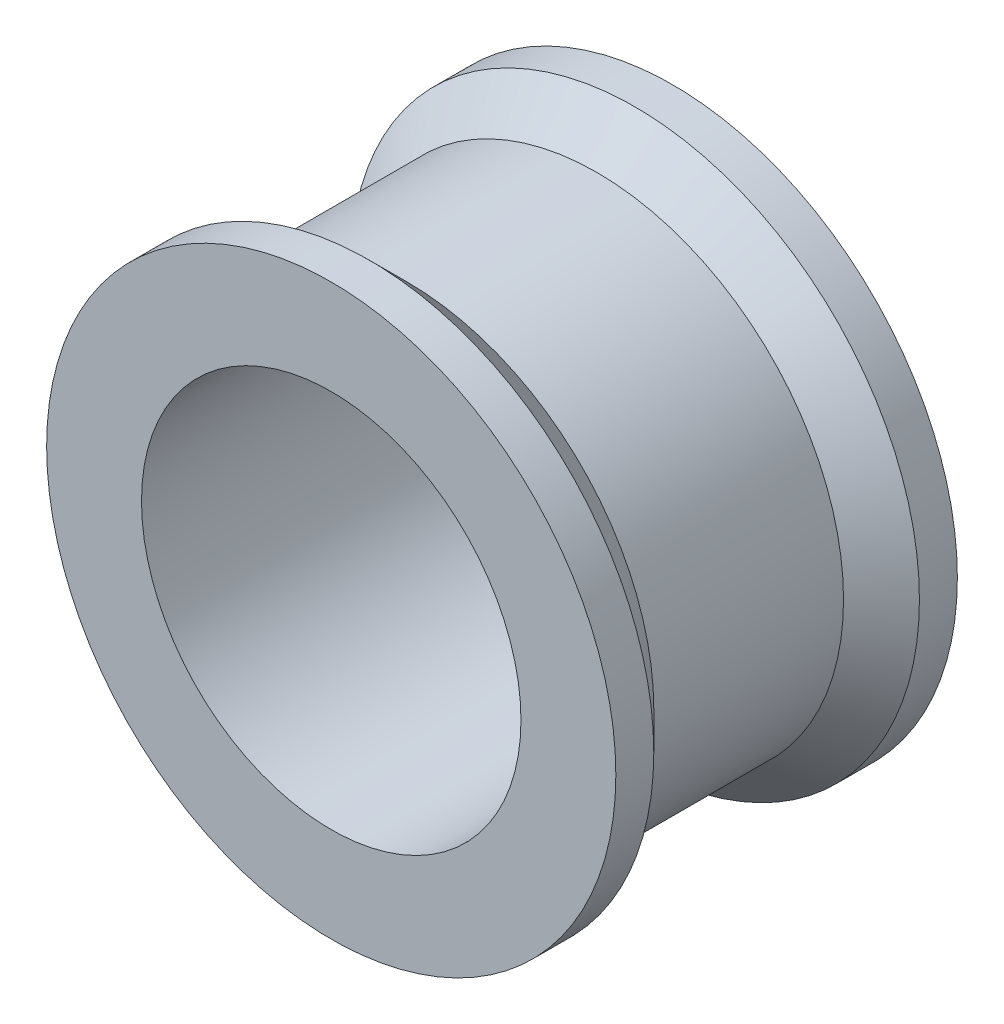
ISO-10303-21;
HEADER;
FILE_DESCRIPTION(('STEP AP214'),'2;1');
FILE_NAME('part.step','',(''),(''),'','','');
FILE_SCHEMA(('AUTOMOTIVE_DESIGN { 1 0 10303 214 1 1 1 1 }'));
ENDSEC;
DATA;
#1=APPLICATION_CONTEXT('core data for automotive mechanical design processes');
#2=APPLICATION_PROTOCOL_DEFINITION('international standard','automotive_design',2000,#1);
#3=PRODUCT_CONTEXT('',#1,'mechanical');
#4=PRODUCT('Part','Part','',(#3));
#5=PRODUCT_RELATED_PRODUCT_CATEGORY('part','',(#4));
#6=PRODUCT_DEFINITION_FORMATION('','',#4);
#7=PRODUCT_DEFINITION_CONTEXT('part definition',#1,'design');
#8=PRODUCT_DEFINITION('design','',#6,#7);
#9=PRODUCT_DEFINITION_SHAPE('','',#8);
#10=(LENGTH_UNIT() NAMED_UNIT(*) SI_UNIT(.MILLI.,.METRE.));
#11=(NAMED_UNIT(*) PLANE_ANGLE_UNIT() SI_UNIT($,.RADIAN.));
#12=(NAMED_UNIT(*) SI_UNIT($,.STERADIAN.) SOLID_ANGLE_UNIT());
#13=UNCERTAINTY_MEASURE_WITH_UNIT(LENGTH_MEASURE(1.E-05),#10,'distance_accuracy_value','');
#14=(GEOMETRIC_REPRESENTATION_CONTEXT(3) GLOBAL_UNCERTAINTY_ASSIGNED_CONTEXT((#13)) GLOBAL_UNIT_ASSIGNED_CONTEXT((#10,
#11,#12)) REPRESENTATION_CONTEXT('',''));
#15=CARTESIAN_POINT('',(0.,0.,0.));
#16=DIRECTION('',(0.,0.,1.));
#17=DIRECTION('',(1.,0.,0.));
#18=AXIS2_PLACEMENT_3D('',#15,#16,#17);
#19=CARTESIAN_POINT('',(0.,0.,0.));
#20=DIRECTION('',(0.,0.,1.));
#21=DIRECTION('',(1.,0.,0.));
#22=AXIS2_PLACEMENT_3D('',#19,#20,#21);
#23=PLANE('',#22);
#24=CARTESIAN_POINT('',(0.,0.,0.));
#25=DIRECTION('',(0.,0.,1.));
#26=DIRECTION('',(1.,0.,0.));
#27=AXIS2_PLACEMENT_3D('',#24,#25,#26);
#28=CIRCLE('',#27,7.5);
#29=CARTESIAN_POINT('',(7.5,0.,0.));
#30=VERTEX_POINT('',#29);
#31=EDGE_CURVE('E42',#30,#30,#28,.T.);
#32=ORIENTED_EDGE('',*,*,#31,.F.);
#33=EDGE_LOOP('',(#32));
#34=FACE_BOUND('',#33,.T.);
#35=CARTESIAN_POINT('',(0.,0.,0.));
#36=DIRECTION('',(0.,0.,1.));
#37=DIRECTION('',(1.,0.,0.));
#38=AXIS2_PLACEMENT_3D('',#35,#36,#37);
#39=CIRCLE('',#38,5.);
#40=CARTESIAN_POINT('',(5.,0.,0.));
#41=VERTEX_POINT('',#40);
#42=EDGE_CURVE('E47',#41,#41,#39,.T.);
#43=ORIENTED_EDGE('',*,*,#42,.T.);
#44=EDGE_LOOP('',(#43));
#45=FACE_BOUND('',#44,.T.);
#46=ADVANCED_FACE('F31',(#34,#45),#23,.F.);
#47=CARTESIAN_POINT('',(0.,0.,1.));
#48=DIRECTION('',(0.,0.,-1.));
#49=DIRECTION('',(-1.,0.,0.));
#50=AXIS2_PLACEMENT_3D('',#47,#48,#49);
#51=CYLINDRICAL_SURFACE('',#50,7.5);
#52=CARTESIAN_POINT('',(0.,0.,1.));
#53=DIRECTION('',(0.,0.,1.));
#54=DIRECTION('',(1.,0.,0.));
#55=AXIS2_PLACEMENT_3D('',#52,#53,#54);
#56=CIRCLE('',#55,7.5);
#57=CARTESIAN_POINT('',(7.5,0.,1.));
#58=VERTEX_POINT('',#57);
#59=EDGE_CURVE('E38',#58,#58,#56,.T.);
#60=ORIENTED_EDGE('',*,*,#59,.F.);
#61=EDGE_LOOP('',(#60));
#62=FACE_BOUND('',#61,.T.);
#63=ORIENTED_EDGE('',*,*,#31,.T.);
#64=EDGE_LOOP('',(#63));
#65=FACE_BOUND('',#64,.T.);
#66=ADVANCED_FACE('F80',(#62,#65),#51,.T.);
#67=CARTESIAN_POINT('',(0.,0.,1.));
#68=DIRECTION('',(0.,0.,-1.));
#69=DIRECTION('',(-1.,0.,0.));
#70=AXIS2_PLACEMENT_3D('',#67,#68,#69);
#71=CYLINDRICAL_SURFACE('',#70,5.);
#72=ORIENTED_EDGE('',*,*,#42,.F.);
#73=EDGE_LOOP('',(#72));
#74=FACE_BOUND('',#73,.T.);
#75=CARTESIAN_POINT('',(0.,0.,9.));
#76=DIRECTION('',(0.,0.,1.));
#77=DIRECTION('',(1.,0.,0.));
#78=AXIS2_PLACEMENT_3D('',#75,#76,#77);
#79=CIRCLE('',#78,5.);
#80=CARTESIAN_POINT('',(5.,0.,9.));
#81=VERTEX_POINT('',#80);
#82=EDGE_CURVE('E58',#81,#81,#79,.T.);
#83=ORIENTED_EDGE('',*,*,#82,.T.);
#84=EDGE_LOOP('',(#83));
#85=FACE_BOUND('',#84,.T.);
#86=ADVANCED_FACE('F64',(#74,#85),#71,.F.);
#87=CARTESIAN_POINT('',(0.,0.,4.5));
#88=DIRECTION('',(0.,0.,-1.));
#89=DIRECTION('',(-1.,0.,0.));
#90=AXIS2_PLACEMENT_3D('',#87,#88,#89);
#91=CYLINDRICAL_SURFACE('',#90,6.5);
#92=CARTESIAN_POINT('',(0.,0.,2.00000000000001));
#93=DIRECTION('',(0.,0.,1.));
#94=DIRECTION('',(1.,0.,0.));
#95=AXIS2_PLACEMENT_3D('',#92,#93,#94);
#96=CIRCLE('',#95,6.5);
#97=CARTESIAN_POINT('',(6.5,0.,2.00000000000001));
#98=VERTEX_POINT('',#97);
#99=EDGE_CURVE('E10',#98,#98,#96,.T.);
#100=ORIENTED_EDGE('',*,*,#99,.T.);
#101=EDGE_LOOP('',(#100));
#102=FACE_BOUND('',#101,.T.);
#103=CARTESIAN_POINT('',(0.,0.,6.99999999999999));
#104=DIRECTION('',(0.,0.,1.));
#105=DIRECTION('',(1.,0.,0.));
#106=AXIS2_PLACEMENT_3D('',#103,#104,#105);
#107=CIRCLE('',#106,6.5);
#108=CARTESIAN_POINT('',(6.5,0.,6.99999999999999));
#109=VERTEX_POINT('',#108);
#110=EDGE_CURVE('E51',#109,#109,#107,.T.);
#111=ORIENTED_EDGE('',*,*,#110,.F.);
#112=EDGE_LOOP('',(#111));
#113=FACE_BOUND('',#112,.T.);
#114=ADVANCED_FACE('F78',(#102,#113),#91,.T.);
#115=CARTESIAN_POINT('',(0.,0.,2.00000000000001));
#116=DIRECTION('',(0.,0.,-1.));
#117=DIRECTION('',(-1.,0.,0.));
#118=AXIS2_PLACEMENT_3D('',#115,#116,#117);
#119=CONICAL_SURFACE('',#118,6.5,0.785398163397444);
#120=ORIENTED_EDGE('',*,*,#59,.T.);
#121=EDGE_LOOP('',(#120));
#122=FACE_BOUND('',#121,.T.);
#123=ORIENTED_EDGE('',*,*,#99,.F.);
#124=EDGE_LOOP('',(#123));
#125=FACE_BOUND('',#124,.T.);
#126=ADVANCED_FACE('F33',(#122,#125),#119,.T.);
#127=CARTESIAN_POINT('',(0.,0.,9.));
#128=DIRECTION('',(0.,0.,-1.));
#129=DIRECTION('',(1.,0.,0.));
#130=AXIS2_PLACEMENT_3D('',#127,#128,#129);
#131=PLANE('',#130);
#132=CARTESIAN_POINT('',(0.,0.,9.));
#133=DIRECTION('',(0.,0.,1.));
#134=DIRECTION('',(1.,0.,0.));
#135=AXIS2_PLACEMENT_3D('',#132,#133,#134);
#136=CIRCLE('',#135,7.5);
#137=CARTESIAN_POINT('',(7.5,0.,9.));
#138=VERTEX_POINT('',#137);
#139=EDGE_CURVE('E55',#138,#138,#136,.T.);
#140=ORIENTED_EDGE('',*,*,#139,.T.);
#141=EDGE_LOOP('',(#140));
#142=FACE_BOUND('',#141,.T.);
#143=ORIENTED_EDGE('',*,*,#82,.F.);
#144=EDGE_LOOP('',(#143));
#145=FACE_BOUND('',#144,.T.);
#146=ADVANCED_FACE('F66',(#142,#145),#131,.F.);
#147=CARTESIAN_POINT('',(0.,0.,8.));
#148=DIRECTION('',(0.,0.,1.));
#149=DIRECTION('',(-1.,0.,0.));
#150=AXIS2_PLACEMENT_3D('',#147,#148,#149);
#151=CYLINDRICAL_SURFACE('',#150,7.5);
#152=CARTESIAN_POINT('',(0.,0.,8.));
#153=DIRECTION('',(0.,0.,1.));
#154=DIRECTION('',(1.,0.,0.));
#155=AXIS2_PLACEMENT_3D('',#152,#153,#154);
#156=CIRCLE('',#155,7.5);
#157=CARTESIAN_POINT('',(7.5,0.,8.));
#158=VERTEX_POINT('',#157);
#159=EDGE_CURVE('E54',#158,#158,#156,.T.);
#160=ORIENTED_EDGE('',*,*,#159,.T.);
#161=EDGE_LOOP('',(#160));
#162=FACE_BOUND('',#161,.T.);
#163=ORIENTED_EDGE('',*,*,#139,.F.);
#164=EDGE_LOOP('',(#163));
#165=FACE_BOUND('',#164,.T.);
#166=ADVANCED_FACE('F68',(#162,#165),#151,.T.);
#167=CARTESIAN_POINT('',(0.,0.,6.99999999999999));
#168=DIRECTION('',(0.,0.,1.));
#169=DIRECTION('',(-1.,0.,0.));
#170=AXIS2_PLACEMENT_3D('',#167,#168,#169);
#171=CONICAL_SURFACE('',#170,6.5,0.785398163397444);
#172=ORIENTED_EDGE('',*,*,#159,.F.);
#173=EDGE_LOOP('',(#172));
#174=FACE_BOUND('',#173,.T.);
#175=ORIENTED_EDGE('',*,*,#110,.T.);
#176=EDGE_LOOP('',(#175));
#177=FACE_BOUND('',#176,.T.);
#178=ADVANCED_FACE('F75',(#174,#177),#171,.T.);
#179=CLOSED_SHELL('',(#46,#66,#86,#114,#126,#146,#166,#178));
#180=MANIFOLD_SOLID_BREP('B2',#179);
#181=ADVANCED_BREP_SHAPE_REPRESENTATION('',(#18,#180),#14);
#182=SHAPE_DEFINITION_REPRESENTATION(#9,#181);
ENDSEC;
END-ISO-10303-21;
